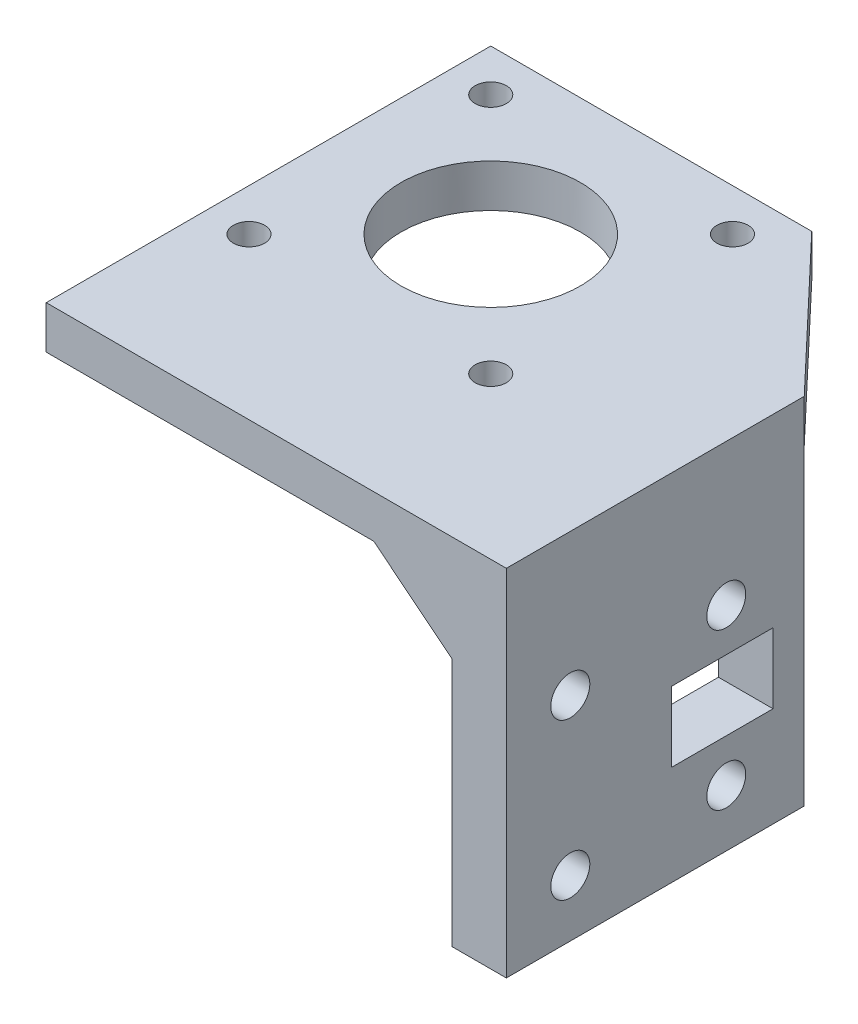
ISO-10303-21;
HEADER;
FILE_DESCRIPTION(('STEP AP214'),'2;1');
FILE_NAME('part.step','',(''),(''),'','','');
FILE_SCHEMA(('AUTOMOTIVE_DESIGN { 1 0 10303 214 1 1 1 1 }'));
ENDSEC;
DATA;
#1=APPLICATION_CONTEXT('core data for automotive mechanical design processes');
#2=APPLICATION_PROTOCOL_DEFINITION('international standard','automotive_design',2000,#1);
#3=PRODUCT_CONTEXT('',#1,'mechanical');
#4=PRODUCT('Part','Part','',(#3));
#5=PRODUCT_RELATED_PRODUCT_CATEGORY('part','',(#4));
#6=PRODUCT_DEFINITION_FORMATION('','',#4);
#7=PRODUCT_DEFINITION_CONTEXT('part definition',#1,'design');
#8=PRODUCT_DEFINITION('design','',#6,#7);
#9=PRODUCT_DEFINITION_SHAPE('','',#8);
#10=(LENGTH_UNIT() NAMED_UNIT(*) SI_UNIT(.MILLI.,.METRE.));
#11=(NAMED_UNIT(*) PLANE_ANGLE_UNIT() SI_UNIT($,.RADIAN.));
#12=(NAMED_UNIT(*) SI_UNIT($,.STERADIAN.) SOLID_ANGLE_UNIT());
#13=UNCERTAINTY_MEASURE_WITH_UNIT(LENGTH_MEASURE(1.E-05),#10,'distance_accuracy_value','');
#14=(GEOMETRIC_REPRESENTATION_CONTEXT(3) GLOBAL_UNCERTAINTY_ASSIGNED_CONTEXT((#13)) GLOBAL_UNIT_ASSIGNED_CONTEXT((#10,
#11,#12)) REPRESENTATION_CONTEXT('',''));
#15=CARTESIAN_POINT('',(0.,0.,0.));
#16=DIRECTION('',(0.,0.,1.));
#17=DIRECTION('',(1.,0.,0.));
#18=AXIS2_PLACEMENT_3D('',#15,#16,#17);
#19=CARTESIAN_POINT('',(0.,5.5,0.));
#20=DIRECTION('',(-1.,0.,0.));
#21=DIRECTION('',(0.,0.,1.));
#22=AXIS2_PLACEMENT_3D('',#19,#20,#21);
#23=PLANE('',#22);
#24=DIRECTION('',(0.,0.,-1.));
#25=VECTOR('',#24,1.);
#26=CARTESIAN_POINT('',(0.,-18.2,0.));
#27=LINE('',#26,#25);
#28=CARTESIAN_POINT('',(0.,-18.2,35.8));
#29=VERTEX_POINT('',#28);
#30=CARTESIAN_POINT('',(0.,-18.2,22.8));
#31=VERTEX_POINT('',#30);
#32=EDGE_CURVE('E155',#29,#31,#27,.T.);
#33=ORIENTED_EDGE('',*,*,#32,.T.);
#34=DIRECTION('',(0.,-1.,0.));
#35=VECTOR('',#34,1.);
#36=CARTESIAN_POINT('',(0.,5.5,22.8));
#37=LINE('',#36,#35);
#38=CARTESIAN_POINT('',(0.,-27.2,22.8));
#39=VERTEX_POINT('',#38);
#40=EDGE_CURVE('E158',#31,#39,#37,.T.);
#41=ORIENTED_EDGE('',*,*,#40,.T.);
#42=DIRECTION('',(0.,0.,1.));
#43=VECTOR('',#42,1.);
#44=CARTESIAN_POINT('',(0.,-27.2,0.));
#45=LINE('',#44,#43);
#46=CARTESIAN_POINT('',(0.,-27.2,35.8));
#47=VERTEX_POINT('',#46);
#48=EDGE_CURVE('E150',#39,#47,#45,.T.);
#49=ORIENTED_EDGE('',*,*,#48,.T.);
#50=DIRECTION('',(0.,1.,0.));
#51=VECTOR('',#50,1.);
#52=CARTESIAN_POINT('',(0.,5.5,35.8));
#53=LINE('',#52,#51);
#54=EDGE_CURVE('E130',#47,#29,#53,.T.);
#55=ORIENTED_EDGE('',*,*,#54,.T.);
#56=EDGE_LOOP('',(#33,#41,#49,#55));
#57=FACE_BOUND('',#56,.T.);
#58=CARTESIAN_POINT('',(0.,-12.7,48.8));
#59=DIRECTION('',(-1.,0.,0.));
#60=DIRECTION('',(0.,0.,1.));
#61=AXIS2_PLACEMENT_3D('',#58,#59,#60);
#62=CIRCLE('',#61,2.49999999999999);
#63=CARTESIAN_POINT('',(0.,-12.7,51.3));
#64=VERTEX_POINT('',#63);
#65=EDGE_CURVE('E210',#64,#64,#62,.T.);
#66=ORIENTED_EDGE('',*,*,#65,.T.);
#67=EDGE_LOOP('',(#66));
#68=FACE_BOUND('',#67,.T.);
#69=CARTESIAN_POINT('',(0.,-32.7,28.8));
#70=DIRECTION('',(-1.,0.,0.));
#71=DIRECTION('',(0.,0.,1.));
#72=AXIS2_PLACEMENT_3D('',#69,#70,#71);
#73=CIRCLE('',#72,2.50000000000001);
#74=CARTESIAN_POINT('',(0.,-32.7,31.3));
#75=VERTEX_POINT('',#74);
#76=EDGE_CURVE('E207',#75,#75,#73,.T.);
#77=ORIENTED_EDGE('',*,*,#76,.T.);
#78=EDGE_LOOP('',(#77));
#79=FACE_BOUND('',#78,.T.);
#80=CARTESIAN_POINT('',(0.,-12.7,28.8));
#81=DIRECTION('',(-1.,0.,0.));
#82=DIRECTION('',(0.,0.,1.));
#83=AXIS2_PLACEMENT_3D('',#80,#81,#82);
#84=CIRCLE('',#83,2.5);
#85=CARTESIAN_POINT('',(0.,-12.7,31.3));
#86=VERTEX_POINT('',#85);
#87=EDGE_CURVE('E204',#86,#86,#84,.T.);
#88=ORIENTED_EDGE('',*,*,#87,.T.);
#89=EDGE_LOOP('',(#88));
#90=FACE_BOUND('',#89,.T.);
#91=CARTESIAN_POINT('',(0.,-32.7,48.8));
#92=DIRECTION('',(-1.,0.,0.));
#93=DIRECTION('',(0.,0.,1.));
#94=AXIS2_PLACEMENT_3D('',#91,#92,#93);
#95=CIRCLE('',#94,2.5);
#96=CARTESIAN_POINT('',(0.,-32.7,51.3));
#97=VERTEX_POINT('',#96);
#98=EDGE_CURVE('E201',#97,#97,#95,.T.);
#99=ORIENTED_EDGE('',*,*,#98,.T.);
#100=EDGE_LOOP('',(#99));
#101=FACE_BOUND('',#100,.T.);
#102=DIRECTION('',(0.,1.,0.));
#103=VECTOR('',#102,1.);
#104=CARTESIAN_POINT('',(0.,5.5,18.8));
#105=LINE('',#104,#103);
#106=CARTESIAN_POINT('',(0.,-40.,18.8));
#107=VERTEX_POINT('',#106);
#108=CARTESIAN_POINT('',(0.,0.,18.8));
#109=VERTEX_POINT('',#108);
#110=EDGE_CURVE('E186',#107,#109,#105,.T.);
#111=ORIENTED_EDGE('',*,*,#110,.T.);
#112=DIRECTION('',(0.,-1.,0.));
#113=VECTOR('',#112,1.);
#114=CARTESIAN_POINT('',(0.,33.,18.8));
#115=LINE('',#114,#113);
#116=CARTESIAN_POINT('',(0.,5.5,18.8));
#117=VERTEX_POINT('',#116);
#118=EDGE_CURVE('E173',#117,#109,#115,.T.);
#119=ORIENTED_EDGE('',*,*,#118,.F.);
#120=DIRECTION('',(0.,0.,-1.));
#121=VECTOR('',#120,1.);
#122=CARTESIAN_POINT('',(0.,5.5,0.));
#123=LINE('',#122,#121);
#124=CARTESIAN_POINT('',(0.,5.5,57.));
#125=VERTEX_POINT('',#124);
#126=EDGE_CURVE('E236',#125,#117,#123,.T.);
#127=ORIENTED_EDGE('',*,*,#126,.F.);
#128=DIRECTION('',(0.,-1.,0.));
#129=VECTOR('',#128,1.);
#130=CARTESIAN_POINT('',(0.,5.5,57.));
#131=LINE('',#130,#129);
#132=CARTESIAN_POINT('',(0.,-40.,57.));
#133=VERTEX_POINT('',#132);
#134=EDGE_CURVE('E246',#125,#133,#131,.T.);
#135=ORIENTED_EDGE('',*,*,#134,.T.);
#136=DIRECTION('',(0.,0.,1.));
#137=VECTOR('',#136,1.);
#138=CARTESIAN_POINT('',(0.,-40.,0.));
#139=LINE('',#138,#137);
#140=EDGE_CURVE('E213',#107,#133,#139,.T.);
#141=ORIENTED_EDGE('',*,*,#140,.F.);
#142=EDGE_LOOP('',(#111,#119,#127,#135,#141));
#143=FACE_BOUND('',#142,.T.);
#144=ADVANCED_FACE('F33',(#57,#68,#79,#90,#101,#143),#23,.F.);
#145=CARTESIAN_POINT('',(0.,5.5,0.));
#146=DIRECTION('',(0.,0.,1.));
#147=DIRECTION('',(1.,0.,0.));
#148=AXIS2_PLACEMENT_3D('',#145,#146,#147);
#149=PLANE('',#148);
#150=DIRECTION('',(-1.,0.,0.));
#151=VECTOR('',#150,1.);
#152=CARTESIAN_POINT('',(0.,5.5,0.));
#153=LINE('',#152,#151);
#154=CARTESIAN_POINT('',(-17.836375113518,5.5,0.));
#155=VERTEX_POINT('',#154);
#156=CARTESIAN_POINT('',(-59.,5.5,0.));
#157=VERTEX_POINT('',#156);
#158=EDGE_CURVE('E239',#155,#157,#153,.T.);
#159=ORIENTED_EDGE('',*,*,#158,.F.);
#160=DIRECTION('',(0.,-1.,0.));
#161=VECTOR('',#160,1.);
#162=CARTESIAN_POINT('',(-17.836375113518,33.,0.));
#163=LINE('',#162,#161);
#164=CARTESIAN_POINT('',(-17.836375113518,0.,0.));
#165=VERTEX_POINT('',#164);
#166=EDGE_CURVE('E174',#155,#165,#163,.T.);
#167=ORIENTED_EDGE('',*,*,#166,.T.);
#168=DIRECTION('',(-1.,0.,0.));
#169=VECTOR('',#168,1.);
#170=CARTESIAN_POINT('',(0.,0.,0.));
#171=LINE('',#170,#169);
#172=CARTESIAN_POINT('',(-59.,0.,0.));
#173=VERTEX_POINT('',#172);
#174=EDGE_CURVE('E247',#165,#173,#171,.T.);
#175=ORIENTED_EDGE('',*,*,#174,.T.);
#176=DIRECTION('',(0.,-1.,0.));
#177=VECTOR('',#176,1.);
#178=CARTESIAN_POINT('',(-59.,5.5,0.));
#179=LINE('',#178,#177);
#180=EDGE_CURVE('E41',#157,#173,#179,.T.);
#181=ORIENTED_EDGE('',*,*,#180,.F.);
#182=EDGE_LOOP('',(#159,#167,#175,#181));
#183=FACE_BOUND('',#182,.T.);
#184=ADVANCED_FACE('F334',(#183),#149,.F.);
#185=CARTESIAN_POINT('',(-59.,5.5,0.));
#186=DIRECTION('',(1.,0.,0.));
#187=DIRECTION('',(0.,0.,-1.));
#188=AXIS2_PLACEMENT_3D('',#185,#186,#187);
#189=PLANE('',#188);
#190=DIRECTION('',(0.,0.,1.));
#191=VECTOR('',#190,1.);
#192=CARTESIAN_POINT('',(-59.,0.,0.));
#193=LINE('',#192,#191);
#194=CARTESIAN_POINT('',(-59.,0.,57.));
#195=VERTEX_POINT('',#194);
#196=EDGE_CURVE('E249',#173,#195,#193,.T.);
#197=ORIENTED_EDGE('',*,*,#196,.T.);
#198=DIRECTION('',(0.,-1.,0.));
#199=VECTOR('',#198,1.);
#200=CARTESIAN_POINT('',(-59.,5.5,57.));
#201=LINE('',#200,#199);
#202=CARTESIAN_POINT('',(-59.,5.5,57.));
#203=VERTEX_POINT('',#202);
#204=EDGE_CURVE('E256',#203,#195,#201,.T.);
#205=ORIENTED_EDGE('',*,*,#204,.F.);
#206=DIRECTION('',(0.,0.,1.));
#207=VECTOR('',#206,1.);
#208=CARTESIAN_POINT('',(-59.,5.5,0.));
#209=LINE('',#208,#207);
#210=EDGE_CURVE('E242',#157,#203,#209,.T.);
#211=ORIENTED_EDGE('',*,*,#210,.F.);
#212=ORIENTED_EDGE('',*,*,#180,.T.);
#213=EDGE_LOOP('',(#197,#205,#211,#212));
#214=FACE_BOUND('',#213,.T.);
#215=ADVANCED_FACE('F330',(#214),#189,.F.);
#216=CARTESIAN_POINT('',(0.,5.5,57.));
#217=DIRECTION('',(0.,0.,-1.));
#218=DIRECTION('',(-1.,0.,0.));
#219=AXIS2_PLACEMENT_3D('',#216,#217,#218);
#220=PLANE('',#219);
#221=DIRECTION('',(1.,0.,0.));
#222=VECTOR('',#221,1.);
#223=CARTESIAN_POINT('',(0.,0.,57.));
#224=LINE('',#223,#222);
#225=CARTESIAN_POINT('',(-17.,0.,57.));
#226=VERTEX_POINT('',#225);
#227=EDGE_CURVE('E240',#195,#226,#224,.T.);
#228=ORIENTED_EDGE('',*,*,#227,.T.);
#229=DIRECTION('',(0.78086880944303,-0.624695047554425,0.));
#230=VECTOR('',#229,1.);
#231=CARTESIAN_POINT('',(-7.00000000000001,-8.,57.));
#232=LINE('',#231,#230);
#233=CARTESIAN_POINT('',(-7.00000000000001,-8.,57.));
#234=VERTEX_POINT('',#233);
#235=EDGE_CURVE('E161',#226,#234,#232,.T.);
#236=ORIENTED_EDGE('',*,*,#235,.T.);
#237=DIRECTION('',(0.,1.,0.));
#238=VECTOR('',#237,1.);
#239=CARTESIAN_POINT('',(-7.00000000000001,-40.,57.));
#240=LINE('',#239,#238);
#241=CARTESIAN_POINT('',(-7.00000000000001,-40.,57.));
#242=VERTEX_POINT('',#241);
#243=EDGE_CURVE('E220',#242,#234,#240,.T.);
#244=ORIENTED_EDGE('',*,*,#243,.F.);
#245=DIRECTION('',(-1.,0.,0.));
#246=VECTOR('',#245,1.);
#247=CARTESIAN_POINT('',(0.,-40.,57.));
#248=LINE('',#247,#246);
#249=EDGE_CURVE('E215',#133,#242,#248,.T.);
#250=ORIENTED_EDGE('',*,*,#249,.F.);
#251=ORIENTED_EDGE('',*,*,#134,.F.);
#252=DIRECTION('',(1.,0.,0.));
#253=VECTOR('',#252,1.);
#254=CARTESIAN_POINT('',(0.,5.5,57.));
#255=LINE('',#254,#253);
#256=EDGE_CURVE('E244',#203,#125,#255,.T.);
#257=ORIENTED_EDGE('',*,*,#256,.F.);
#258=ORIENTED_EDGE('',*,*,#204,.T.);
#259=EDGE_LOOP('',(#228,#236,#244,#250,#251,#257,#258));
#260=FACE_BOUND('',#259,.T.);
#261=ADVANCED_FACE('F296',(#260),#220,.F.);
#262=CARTESIAN_POINT('',(0.,5.5,0.));
#263=DIRECTION('',(0.,-1.,0.));
#264=DIRECTION('',(0.,0.,-1.));
#265=AXIS2_PLACEMENT_3D('',#262,#263,#264);
#266=PLANE('',#265);
#267=CARTESIAN_POINT('',(-38.1,5.5,20.9));
#268=DIRECTION('',(0.,1.,0.));
#269=DIRECTION('',(0.,0.,1.));
#270=AXIS2_PLACEMENT_3D('',#267,#268,#269);
#271=CIRCLE('',#270,11.5);
#272=CARTESIAN_POINT('',(-38.1,5.5,32.4));
#273=VERTEX_POINT('',#272);
#274=EDGE_CURVE('E403',#273,#273,#271,.T.);
#275=ORIENTED_EDGE('',*,*,#274,.F.);
#276=EDGE_LOOP('',(#275));
#277=FACE_BOUND('',#276,.T.);
#278=CARTESIAN_POINT('',(-22.6,5.5,5.4));
#279=DIRECTION('',(0.,1.,0.));
#280=DIRECTION('',(0.,0.,1.));
#281=AXIS2_PLACEMENT_3D('',#278,#279,#280);
#282=CIRCLE('',#281,2.);
#283=CARTESIAN_POINT('',(-22.6,5.5,7.4));
#284=VERTEX_POINT('',#283);
#285=EDGE_CURVE('E227',#284,#284,#282,.T.);
#286=ORIENTED_EDGE('',*,*,#285,.F.);
#287=EDGE_LOOP('',(#286));
#288=FACE_BOUND('',#287,.T.);
#289=CARTESIAN_POINT('',(-53.6,5.5,36.4));
#290=DIRECTION('',(0.,1.,0.));
#291=DIRECTION('',(0.,0.,1.));
#292=AXIS2_PLACEMENT_3D('',#289,#290,#291);
#293=CIRCLE('',#292,2.);
#294=CARTESIAN_POINT('',(-53.6,5.5,38.4));
#295=VERTEX_POINT('',#294);
#296=EDGE_CURVE('E226',#295,#295,#293,.T.);
#297=ORIENTED_EDGE('',*,*,#296,.F.);
#298=EDGE_LOOP('',(#297));
#299=FACE_BOUND('',#298,.T.);
#300=CARTESIAN_POINT('',(-22.6,5.5,36.4));
#301=DIRECTION('',(0.,1.,0.));
#302=DIRECTION('',(0.,0.,1.));
#303=AXIS2_PLACEMENT_3D('',#300,#301,#302);
#304=CIRCLE('',#303,2.);
#305=CARTESIAN_POINT('',(-22.6,5.5,38.4));
#306=VERTEX_POINT('',#305);
#307=EDGE_CURVE('E223',#306,#306,#304,.T.);
#308=ORIENTED_EDGE('',*,*,#307,.F.);
#309=EDGE_LOOP('',(#308));
#310=FACE_BOUND('',#309,.T.);
#311=CARTESIAN_POINT('',(-53.6,5.5,5.4));
#312=DIRECTION('',(0.,1.,0.));
#313=DIRECTION('',(0.,0.,1.));
#314=AXIS2_PLACEMENT_3D('',#311,#312,#313);
#315=CIRCLE('',#314,2.);
#316=CARTESIAN_POINT('',(-53.6,5.5,7.4));
#317=VERTEX_POINT('',#316);
#318=EDGE_CURVE('E230',#317,#317,#315,.T.);
#319=ORIENTED_EDGE('',*,*,#318,.F.);
#320=EDGE_LOOP('',(#319));
#321=FACE_BOUND('',#320,.T.);
#322=ORIENTED_EDGE('',*,*,#126,.T.);
#323=DIRECTION('',(-0.688270132904109,0.,-0.725454494887281));
#324=VECTOR('',#323,1.);
#325=CARTESIAN_POINT('',(-9.38700283830471,5.5,8.9058565859394));
#326=LINE('',#325,#324);
#327=EDGE_CURVE('E177',#117,#155,#326,.T.);
#328=ORIENTED_EDGE('',*,*,#327,.T.);
#329=ORIENTED_EDGE('',*,*,#158,.T.);
#330=ORIENTED_EDGE('',*,*,#210,.T.);
#331=ORIENTED_EDGE('',*,*,#256,.T.);
#332=EDGE_LOOP('',(#322,#328,#329,#330,#331));
#333=FACE_BOUND('',#332,.T.);
#334=ADVANCED_FACE('F279',(#277,#288,#299,#310,#321,#333),#266,.F.);
#335=CARTESIAN_POINT('',(0.,0.,0.));
#336=DIRECTION('',(0.,-1.,0.));
#337=DIRECTION('',(0.,0.,-1.));
#338=AXIS2_PLACEMENT_3D('',#335,#336,#337);
#339=PLANE('',#338);
#340=CARTESIAN_POINT('',(-38.1,0.,20.9));
#341=DIRECTION('',(0.,-1.,0.));
#342=DIRECTION('',(0.,0.,-1.));
#343=AXIS2_PLACEMENT_3D('',#340,#341,#342);
#344=CIRCLE('',#343,11.5);
#345=CARTESIAN_POINT('',(-38.1,0.,9.4));
#346=VERTEX_POINT('',#345);
#347=EDGE_CURVE('E36',#346,#346,#344,.T.);
#348=ORIENTED_EDGE('',*,*,#347,.F.);
#349=EDGE_LOOP('',(#348));
#350=FACE_BOUND('',#349,.T.);
#351=DIRECTION('',(0.,0.,1.));
#352=VECTOR('',#351,1.);
#353=CARTESIAN_POINT('',(-17.,0.,18.8));
#354=LINE('',#353,#352);
#355=CARTESIAN_POINT('',(-17.,0.,18.8));
#356=VERTEX_POINT('',#355);
#357=EDGE_CURVE('E164',#356,#226,#354,.T.);
#358=ORIENTED_EDGE('',*,*,#357,.T.);
#359=ORIENTED_EDGE('',*,*,#227,.F.);
#360=ORIENTED_EDGE('',*,*,#196,.F.);
#361=ORIENTED_EDGE('',*,*,#174,.F.);
#362=DIRECTION('',(-0.688270132904109,0.,-0.725454494887281));
#363=VECTOR('',#362,1.);
#364=CARTESIAN_POINT('',(0.,0.,18.8));
#365=LINE('',#364,#363);
#366=EDGE_CURVE('E169',#109,#165,#365,.T.);
#367=ORIENTED_EDGE('',*,*,#366,.F.);
#368=DIRECTION('',(-1.,0.,0.));
#369=VECTOR('',#368,1.);
#370=CARTESIAN_POINT('',(26.,0.,18.8));
#371=LINE('',#370,#369);
#372=EDGE_CURVE('E184',#109,#356,#371,.T.);
#373=ORIENTED_EDGE('',*,*,#372,.T.);
#374=EDGE_LOOP('',(#358,#359,#360,#361,#367,#373));
#375=FACE_BOUND('',#374,.T.);
#376=CARTESIAN_POINT('',(-22.6,0.,5.4));
#377=DIRECTION('',(0.,-1.,0.));
#378=DIRECTION('',(0.,0.,-1.));
#379=AXIS2_PLACEMENT_3D('',#376,#377,#378);
#380=CIRCLE('',#379,2.);
#381=CARTESIAN_POINT('',(-22.6,0.,3.4));
#382=VERTEX_POINT('',#381);
#383=EDGE_CURVE('E250',#382,#382,#380,.T.);
#384=ORIENTED_EDGE('',*,*,#383,.F.);
#385=EDGE_LOOP('',(#384));
#386=FACE_BOUND('',#385,.T.);
#387=CARTESIAN_POINT('',(-53.6,0.,36.4));
#388=DIRECTION('',(0.,-1.,0.));
#389=DIRECTION('',(0.,0.,-1.));
#390=AXIS2_PLACEMENT_3D('',#387,#388,#389);
#391=CIRCLE('',#390,2.);
#392=CARTESIAN_POINT('',(-53.6,0.,34.4));
#393=VERTEX_POINT('',#392);
#394=EDGE_CURVE('E266',#393,#393,#391,.T.);
#395=ORIENTED_EDGE('',*,*,#394,.F.);
#396=EDGE_LOOP('',(#395));
#397=FACE_BOUND('',#396,.T.);
#398=CARTESIAN_POINT('',(-22.6,0.,36.4));
#399=DIRECTION('',(0.,-1.,0.));
#400=DIRECTION('',(0.,0.,-1.));
#401=AXIS2_PLACEMENT_3D('',#398,#399,#400);
#402=CIRCLE('',#401,2.);
#403=CARTESIAN_POINT('',(-22.6,0.,34.4));
#404=VERTEX_POINT('',#403);
#405=EDGE_CURVE('E263',#404,#404,#402,.T.);
#406=ORIENTED_EDGE('',*,*,#405,.F.);
#407=EDGE_LOOP('',(#406));
#408=FACE_BOUND('',#407,.T.);
#409=CARTESIAN_POINT('',(-53.6,0.,5.4));
#410=DIRECTION('',(0.,-1.,0.));
#411=DIRECTION('',(0.,0.,-1.));
#412=AXIS2_PLACEMENT_3D('',#409,#410,#411);
#413=CIRCLE('',#412,2.);
#414=CARTESIAN_POINT('',(-53.6,0.,3.4));
#415=VERTEX_POINT('',#414);
#416=EDGE_CURVE('E235',#415,#415,#413,.T.);
#417=ORIENTED_EDGE('',*,*,#416,.F.);
#418=EDGE_LOOP('',(#417));
#419=FACE_BOUND('',#418,.T.);
#420=ADVANCED_FACE('F275',(#350,#375,#386,#397,#408,#419),#339,.T.);
#421=CARTESIAN_POINT('',(-53.6,-4.5,5.4));
#422=DIRECTION('',(0.,1.,0.));
#423=DIRECTION('',(0.,0.,1.));
#424=AXIS2_PLACEMENT_3D('',#421,#422,#423);
#425=CYLINDRICAL_SURFACE('',#424,2.);
#426=ORIENTED_EDGE('',*,*,#416,.T.);
#427=EDGE_LOOP('',(#426));
#428=FACE_BOUND('',#427,.T.);
#429=ORIENTED_EDGE('',*,*,#318,.T.);
#430=EDGE_LOOP('',(#429));
#431=FACE_BOUND('',#430,.T.);
#432=ADVANCED_FACE('F278',(#428,#431),#425,.F.);
#433=CARTESIAN_POINT('',(-22.6,-4.5,36.4));
#434=DIRECTION('',(0.,1.,0.));
#435=DIRECTION('',(0.,0.,1.));
#436=AXIS2_PLACEMENT_3D('',#433,#434,#435);
#437=CYLINDRICAL_SURFACE('',#436,2.);
#438=ORIENTED_EDGE('',*,*,#405,.T.);
#439=EDGE_LOOP('',(#438));
#440=FACE_BOUND('',#439,.T.);
#441=ORIENTED_EDGE('',*,*,#307,.T.);
#442=EDGE_LOOP('',(#441));
#443=FACE_BOUND('',#442,.T.);
#444=ADVANCED_FACE('F290',(#440,#443),#437,.F.);
#445=CARTESIAN_POINT('',(-53.6,-4.5,36.4));
#446=DIRECTION('',(0.,1.,0.));
#447=DIRECTION('',(0.,0.,1.));
#448=AXIS2_PLACEMENT_3D('',#445,#446,#447);
#449=CYLINDRICAL_SURFACE('',#448,2.);
#450=ORIENTED_EDGE('',*,*,#394,.T.);
#451=EDGE_LOOP('',(#450));
#452=FACE_BOUND('',#451,.T.);
#453=ORIENTED_EDGE('',*,*,#296,.T.);
#454=EDGE_LOOP('',(#453));
#455=FACE_BOUND('',#454,.T.);
#456=ADVANCED_FACE('F345',(#452,#455),#449,.F.);
#457=CARTESIAN_POINT('',(-22.6,-4.5,5.4));
#458=DIRECTION('',(0.,1.,0.));
#459=DIRECTION('',(0.,0.,1.));
#460=AXIS2_PLACEMENT_3D('',#457,#458,#459);
#461=CYLINDRICAL_SURFACE('',#460,2.);
#462=ORIENTED_EDGE('',*,*,#383,.T.);
#463=EDGE_LOOP('',(#462));
#464=FACE_BOUND('',#463,.T.);
#465=ORIENTED_EDGE('',*,*,#285,.T.);
#466=EDGE_LOOP('',(#465));
#467=FACE_BOUND('',#466,.T.);
#468=ADVANCED_FACE('F272',(#464,#467),#461,.F.);
#469=CARTESIAN_POINT('',(-7.,-40.,0.));
#470=DIRECTION('',(1.,0.,0.));
#471=DIRECTION('',(0.,0.,-1.));
#472=AXIS2_PLACEMENT_3D('',#469,#470,#471);
#473=PLANE('',#472);
#474=DIRECTION('',(0.,0.,1.));
#475=VECTOR('',#474,1.);
#476=CARTESIAN_POINT('',(-7.,-27.2,22.8));
#477=LINE('',#476,#475);
#478=CARTESIAN_POINT('',(-7.,-27.2,22.8));
#479=VERTEX_POINT('',#478);
#480=CARTESIAN_POINT('',(-7.00000000000001,-27.2,35.8));
#481=VERTEX_POINT('',#480);
#482=EDGE_CURVE('E136',#479,#481,#477,.T.);
#483=ORIENTED_EDGE('',*,*,#482,.F.);
#484=DIRECTION('',(0.,-1.,0.));
#485=VECTOR('',#484,1.);
#486=CARTESIAN_POINT('',(-7.,-18.2,22.8));
#487=LINE('',#486,#485);
#488=CARTESIAN_POINT('',(-7.,-18.2,22.8));
#489=VERTEX_POINT('',#488);
#490=EDGE_CURVE('E56',#489,#479,#487,.T.);
#491=ORIENTED_EDGE('',*,*,#490,.F.);
#492=DIRECTION('',(0.,0.,-1.));
#493=VECTOR('',#492,1.);
#494=CARTESIAN_POINT('',(-7.,-18.2,22.8));
#495=LINE('',#494,#493);
#496=CARTESIAN_POINT('',(-7.00000000000001,-18.2,35.8));
#497=VERTEX_POINT('',#496);
#498=EDGE_CURVE('E143',#497,#489,#495,.T.);
#499=ORIENTED_EDGE('',*,*,#498,.F.);
#500=DIRECTION('',(0.,1.,0.));
#501=VECTOR('',#500,1.);
#502=CARTESIAN_POINT('',(-7.00000000000001,-18.2,35.8));
#503=LINE('',#502,#501);
#504=EDGE_CURVE('E127',#481,#497,#503,.T.);
#505=ORIENTED_EDGE('',*,*,#504,.F.);
#506=EDGE_LOOP('',(#483,#491,#499,#505));
#507=FACE_BOUND('',#506,.T.);
#508=CARTESIAN_POINT('',(-7.00000000000001,-12.7,48.8));
#509=DIRECTION('',(-1.,0.,0.));
#510=DIRECTION('',(0.,0.,1.));
#511=AXIS2_PLACEMENT_3D('',#508,#509,#510);
#512=CIRCLE('',#511,2.49999999999999);
#513=CARTESIAN_POINT('',(-7.00000000000001,-12.7,51.3));
#514=VERTEX_POINT('',#513);
#515=EDGE_CURVE('E193',#514,#514,#512,.T.);
#516=ORIENTED_EDGE('',*,*,#515,.F.);
#517=EDGE_LOOP('',(#516));
#518=FACE_BOUND('',#517,.T.);
#519=CARTESIAN_POINT('',(-7.00000000000001,-32.7,28.8));
#520=DIRECTION('',(-1.,0.,0.));
#521=DIRECTION('',(0.,0.,1.));
#522=AXIS2_PLACEMENT_3D('',#519,#520,#521);
#523=CIRCLE('',#522,2.50000000000001);
#524=CARTESIAN_POINT('',(-7.00000000000001,-32.7,31.3));
#525=VERTEX_POINT('',#524);
#526=EDGE_CURVE('E192',#525,#525,#523,.T.);
#527=ORIENTED_EDGE('',*,*,#526,.F.);
#528=EDGE_LOOP('',(#527));
#529=FACE_BOUND('',#528,.T.);
#530=CARTESIAN_POINT('',(-7.00000000000001,-12.7,28.8));
#531=DIRECTION('',(-1.,0.,0.));
#532=DIRECTION('',(0.,0.,1.));
#533=AXIS2_PLACEMENT_3D('',#530,#531,#532);
#534=CIRCLE('',#533,2.5);
#535=CARTESIAN_POINT('',(-7.00000000000001,-12.7,31.3));
#536=VERTEX_POINT('',#535);
#537=EDGE_CURVE('E189',#536,#536,#534,.T.);
#538=ORIENTED_EDGE('',*,*,#537,.F.);
#539=EDGE_LOOP('',(#538));
#540=FACE_BOUND('',#539,.T.);
#541=CARTESIAN_POINT('',(-7.00000000000001,-32.7,48.8));
#542=DIRECTION('',(-1.,0.,0.));
#543=DIRECTION('',(0.,0.,1.));
#544=AXIS2_PLACEMENT_3D('',#541,#542,#543);
#545=CIRCLE('',#544,2.5);
#546=CARTESIAN_POINT('',(-7.00000000000001,-32.7,51.3));
#547=VERTEX_POINT('',#546);
#548=EDGE_CURVE('E196',#547,#547,#545,.T.);
#549=ORIENTED_EDGE('',*,*,#548,.F.);
#550=EDGE_LOOP('',(#549));
#551=FACE_BOUND('',#550,.T.);
#552=ORIENTED_EDGE('',*,*,#243,.T.);
#553=DIRECTION('',(0.,0.,1.));
#554=VECTOR('',#553,1.);
#555=CARTESIAN_POINT('',(-7.00000000000001,-8.,18.8));
#556=LINE('',#555,#554);
#557=CARTESIAN_POINT('',(-7.00000000000001,-8.,18.8));
#558=VERTEX_POINT('',#557);
#559=EDGE_CURVE('E167',#558,#234,#556,.T.);
#560=ORIENTED_EDGE('',*,*,#559,.F.);
#561=DIRECTION('',(0.,1.,0.));
#562=VECTOR('',#561,1.);
#563=CARTESIAN_POINT('',(-7.,-40.,18.8));
#564=LINE('',#563,#562);
#565=CARTESIAN_POINT('',(-7.,-40.,18.8));
#566=VERTEX_POINT('',#565);
#567=EDGE_CURVE('E181',#566,#558,#564,.T.);
#568=ORIENTED_EDGE('',*,*,#567,.F.);
#569=DIRECTION('',(0.,0.,-1.));
#570=VECTOR('',#569,1.);
#571=CARTESIAN_POINT('',(-7.,-40.,0.));
#572=LINE('',#571,#570);
#573=EDGE_CURVE('E217',#242,#566,#572,.T.);
#574=ORIENTED_EDGE('',*,*,#573,.F.);
#575=EDGE_LOOP('',(#552,#560,#568,#574));
#576=FACE_BOUND('',#575,.T.);
#577=ADVANCED_FACE('F140',(#507,#518,#529,#540,#551,#576),#473,.F.);
#578=CARTESIAN_POINT('',(0.,-40.,0.));
#579=DIRECTION('',(0.,-1.,0.));
#580=DIRECTION('',(0.,0.,-1.));
#581=AXIS2_PLACEMENT_3D('',#578,#579,#580);
#582=PLANE('',#581);
#583=DIRECTION('',(-1.,0.,0.));
#584=VECTOR('',#583,1.);
#585=CARTESIAN_POINT('',(0.,-40.,18.8));
#586=LINE('',#585,#584);
#587=EDGE_CURVE('E11',#107,#566,#586,.T.);
#588=ORIENTED_EDGE('',*,*,#587,.F.);
#589=ORIENTED_EDGE('',*,*,#140,.T.);
#590=ORIENTED_EDGE('',*,*,#249,.T.);
#591=ORIENTED_EDGE('',*,*,#573,.T.);
#592=EDGE_LOOP('',(#588,#589,#590,#591));
#593=FACE_BOUND('',#592,.T.);
#594=ADVANCED_FACE('F356',(#593),#582,.T.);
#595=CARTESIAN_POINT('',(26.,-32.7,48.8));
#596=DIRECTION('',(-1.,0.,0.));
#597=DIRECTION('',(0.,0.,1.));
#598=AXIS2_PLACEMENT_3D('',#595,#596,#597);
#599=CYLINDRICAL_SURFACE('',#598,2.5);
#600=ORIENTED_EDGE('',*,*,#548,.T.);
#601=EDGE_LOOP('',(#600));
#602=FACE_BOUND('',#601,.T.);
#603=ORIENTED_EDGE('',*,*,#98,.F.);
#604=EDGE_LOOP('',(#603));
#605=FACE_BOUND('',#604,.T.);
#606=ADVANCED_FACE('F359',(#602,#605),#599,.F.);
#607=CARTESIAN_POINT('',(26.,-12.7,28.8));
#608=DIRECTION('',(-1.,0.,0.));
#609=DIRECTION('',(0.,0.,1.));
#610=AXIS2_PLACEMENT_3D('',#607,#608,#609);
#611=CYLINDRICAL_SURFACE('',#610,2.5);
#612=ORIENTED_EDGE('',*,*,#537,.T.);
#613=EDGE_LOOP('',(#612));
#614=FACE_BOUND('',#613,.T.);
#615=ORIENTED_EDGE('',*,*,#87,.F.);
#616=EDGE_LOOP('',(#615));
#617=FACE_BOUND('',#616,.T.);
#618=ADVANCED_FACE('F363',(#614,#617),#611,.F.);
#619=CARTESIAN_POINT('',(26.,-32.7,28.8));
#620=DIRECTION('',(-1.,0.,0.));
#621=DIRECTION('',(0.,0.,1.));
#622=AXIS2_PLACEMENT_3D('',#619,#620,#621);
#623=CYLINDRICAL_SURFACE('',#622,2.50000000000001);
#624=ORIENTED_EDGE('',*,*,#526,.T.);
#625=EDGE_LOOP('',(#624));
#626=FACE_BOUND('',#625,.T.);
#627=ORIENTED_EDGE('',*,*,#76,.F.);
#628=EDGE_LOOP('',(#627));
#629=FACE_BOUND('',#628,.T.);
#630=ADVANCED_FACE('F365',(#626,#629),#623,.F.);
#631=CARTESIAN_POINT('',(26.,-12.7,48.8));
#632=DIRECTION('',(-1.,0.,0.));
#633=DIRECTION('',(0.,0.,1.));
#634=AXIS2_PLACEMENT_3D('',#631,#632,#633);
#635=CYLINDRICAL_SURFACE('',#634,2.49999999999999);
#636=ORIENTED_EDGE('',*,*,#515,.T.);
#637=EDGE_LOOP('',(#636));
#638=FACE_BOUND('',#637,.T.);
#639=ORIENTED_EDGE('',*,*,#65,.F.);
#640=EDGE_LOOP('',(#639));
#641=FACE_BOUND('',#640,.T.);
#642=ADVANCED_FACE('F368',(#638,#641),#635,.F.);
#643=CARTESIAN_POINT('',(26.,-40.,18.8));
#644=DIRECTION('',(0.,0.,1.));
#645=DIRECTION('',(1.,0.,0.));
#646=AXIS2_PLACEMENT_3D('',#643,#644,#645);
#647=PLANE('',#646);
#648=ORIENTED_EDGE('',*,*,#587,.T.);
#649=ORIENTED_EDGE('',*,*,#567,.T.);
#650=DIRECTION('',(0.78086880944303,-0.624695047554425,0.));
#651=VECTOR('',#650,1.);
#652=CARTESIAN_POINT('',(-7.00000000000001,-8.,18.8));
#653=LINE('',#652,#651);
#654=EDGE_CURVE('E162',#356,#558,#653,.T.);
#655=ORIENTED_EDGE('',*,*,#654,.F.);
#656=ORIENTED_EDGE('',*,*,#372,.F.);
#657=ORIENTED_EDGE('',*,*,#110,.F.);
#658=EDGE_LOOP('',(#648,#649,#655,#656,#657));
#659=FACE_BOUND('',#658,.T.);
#660=ADVANCED_FACE('F317',(#659),#647,.F.);
#661=CARTESIAN_POINT('',(0.,33.,18.8));
#662=DIRECTION('',(-0.725454494887281,0.,0.688270132904109));
#663=DIRECTION('',(0.688270132904109,0.,0.725454494887281));
#664=AXIS2_PLACEMENT_3D('',#661,#662,#663);
#665=PLANE('',#664);
#666=ORIENTED_EDGE('',*,*,#118,.T.);
#667=ORIENTED_EDGE('',*,*,#366,.T.);
#668=ORIENTED_EDGE('',*,*,#166,.F.);
#669=ORIENTED_EDGE('',*,*,#327,.F.);
#670=EDGE_LOOP('',(#666,#667,#668,#669));
#671=FACE_BOUND('',#670,.T.);
#672=ADVANCED_FACE('F309',(#671),#665,.F.);
#673=CARTESIAN_POINT('',(-7.00000000000001,-8.,18.8));
#674=DIRECTION('',(-0.624695047554424,-0.78086880944303,0.));
#675=DIRECTION('',(0.78086880944303,-0.624695047554425,0.));
#676=AXIS2_PLACEMENT_3D('',#673,#674,#675);
#677=PLANE('',#676);
#678=ORIENTED_EDGE('',*,*,#235,.F.);
#679=ORIENTED_EDGE('',*,*,#357,.F.);
#680=ORIENTED_EDGE('',*,*,#654,.T.);
#681=ORIENTED_EDGE('',*,*,#559,.T.);
#682=EDGE_LOOP('',(#678,#679,#680,#681));
#683=FACE_BOUND('',#682,.T.);
#684=ADVANCED_FACE('F322',(#683),#677,.T.);
#685=CARTESIAN_POINT('',(3.,-18.2,22.8));
#686=DIRECTION('',(0.,0.,-1.));
#687=DIRECTION('',(-1.,0.,0.));
#688=AXIS2_PLACEMENT_3D('',#685,#686,#687);
#689=PLANE('',#688);
#690=DIRECTION('',(-1.,0.,0.));
#691=VECTOR('',#690,1.);
#692=CARTESIAN_POINT('',(3.,-18.2,22.8));
#693=LINE('',#692,#691);
#694=EDGE_CURVE('E148',#31,#489,#693,.T.);
#695=ORIENTED_EDGE('',*,*,#694,.T.);
#696=ORIENTED_EDGE('',*,*,#490,.T.);
#697=DIRECTION('',(-1.,0.,0.));
#698=VECTOR('',#697,1.);
#699=CARTESIAN_POINT('',(3.,-27.2,22.8));
#700=LINE('',#699,#698);
#701=EDGE_CURVE('E133',#39,#479,#700,.T.);
#702=ORIENTED_EDGE('',*,*,#701,.F.);
#703=ORIENTED_EDGE('',*,*,#40,.F.);
#704=EDGE_LOOP('',(#695,#696,#702,#703));
#705=FACE_BOUND('',#704,.T.);
#706=ADVANCED_FACE('F382',(#705),#689,.F.);
#707=CARTESIAN_POINT('',(3.,-18.2,22.8));
#708=DIRECTION('',(0.,1.,0.));
#709=DIRECTION('',(0.,0.,1.));
#710=AXIS2_PLACEMENT_3D('',#707,#708,#709);
#711=PLANE('',#710);
#712=DIRECTION('',(-1.,0.,0.));
#713=VECTOR('',#712,1.);
#714=CARTESIAN_POINT('',(2.99999999999999,-18.2,35.8));
#715=LINE('',#714,#713);
#716=EDGE_CURVE('E132',#29,#497,#715,.T.);
#717=ORIENTED_EDGE('',*,*,#716,.T.);
#718=ORIENTED_EDGE('',*,*,#498,.T.);
#719=ORIENTED_EDGE('',*,*,#694,.F.);
#720=ORIENTED_EDGE('',*,*,#32,.F.);
#721=EDGE_LOOP('',(#717,#718,#719,#720));
#722=FACE_BOUND('',#721,.T.);
#723=ADVANCED_FACE('F385',(#722),#711,.F.);
#724=CARTESIAN_POINT('',(2.99999999999999,-18.2,35.8));
#725=DIRECTION('',(0.,0.,1.));
#726=DIRECTION('',(1.,0.,0.));
#727=AXIS2_PLACEMENT_3D('',#724,#725,#726);
#728=PLANE('',#727);
#729=DIRECTION('',(-1.,0.,0.));
#730=VECTOR('',#729,1.);
#731=CARTESIAN_POINT('',(2.99999999999999,-27.2,35.8));
#732=LINE('',#731,#730);
#733=EDGE_CURVE('E48',#47,#481,#732,.T.);
#734=ORIENTED_EDGE('',*,*,#733,.T.);
#735=ORIENTED_EDGE('',*,*,#504,.T.);
#736=ORIENTED_EDGE('',*,*,#716,.F.);
#737=ORIENTED_EDGE('',*,*,#54,.F.);
#738=EDGE_LOOP('',(#734,#735,#736,#737));
#739=FACE_BOUND('',#738,.T.);
#740=ADVANCED_FACE('F124',(#739),#728,.F.);
#741=CARTESIAN_POINT('',(3.,-27.2,22.8));
#742=DIRECTION('',(0.,-1.,0.));
#743=DIRECTION('',(0.,0.,-1.));
#744=AXIS2_PLACEMENT_3D('',#741,#742,#743);
#745=PLANE('',#744);
#746=ORIENTED_EDGE('',*,*,#701,.T.);
#747=ORIENTED_EDGE('',*,*,#482,.T.);
#748=ORIENTED_EDGE('',*,*,#733,.F.);
#749=ORIENTED_EDGE('',*,*,#48,.F.);
#750=EDGE_LOOP('',(#746,#747,#748,#749));
#751=FACE_BOUND('',#750,.T.);
#752=ADVANCED_FACE('F137',(#751),#745,.F.);
#753=CARTESIAN_POINT('',(-38.1,-4.5,20.9));
#754=DIRECTION('',(0.,1.,0.));
#755=DIRECTION('',(0.,0.,1.));
#756=AXIS2_PLACEMENT_3D('',#753,#754,#755);
#757=CYLINDRICAL_SURFACE('',#756,11.5);
#758=ORIENTED_EDGE('',*,*,#347,.T.);
#759=EDGE_LOOP('',(#758));
#760=FACE_BOUND('',#759,.T.);
#761=ORIENTED_EDGE('',*,*,#274,.T.);
#762=EDGE_LOOP('',(#761));
#763=FACE_BOUND('',#762,.T.);
#764=ADVANCED_FACE('F388',(#760,#763),#757,.F.);
#765=CLOSED_SHELL('',(#144,#184,#215,#261,#334,#420,#432,#444,#456,#468,#577,#594,#606,#618,
#630,#642,#660,#672,#684,#706,#723,#740,#752,#764));
#766=MANIFOLD_SOLID_BREP('B2',#765);
#767=ADVANCED_BREP_SHAPE_REPRESENTATION('',(#18,#766),#14);
#768=SHAPE_DEFINITION_REPRESENTATION(#9,#767);
ENDSEC;
END-ISO-10303-21;
